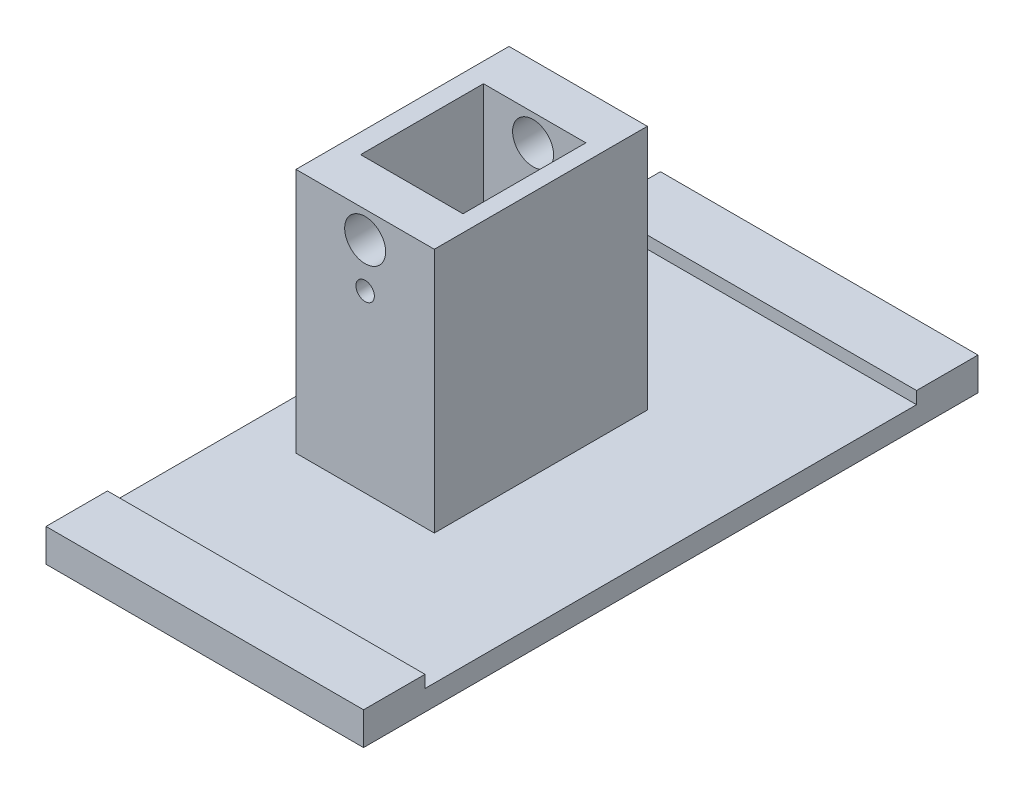
ISO-10303-21;
HEADER;
FILE_DESCRIPTION(('STEP AP214'),'2;1');
FILE_NAME('part.step','',(''),(''),'','','');
FILE_SCHEMA(('AUTOMOTIVE_DESIGN { 1 0 10303 214 1 1 1 1 }'));
ENDSEC;
DATA;
#1=APPLICATION_CONTEXT('core data for automotive mechanical design processes');
#2=APPLICATION_PROTOCOL_DEFINITION('international standard','automotive_design',2000,#1);
#3=PRODUCT_CONTEXT('',#1,'mechanical');
#4=PRODUCT('Part','Part','',(#3));
#5=PRODUCT_RELATED_PRODUCT_CATEGORY('part','',(#4));
#6=PRODUCT_DEFINITION_FORMATION('','',#4);
#7=PRODUCT_DEFINITION_CONTEXT('part definition',#1,'design');
#8=PRODUCT_DEFINITION('design','',#6,#7);
#9=PRODUCT_DEFINITION_SHAPE('','',#8);
#10=(LENGTH_UNIT() NAMED_UNIT(*) SI_UNIT(.MILLI.,.METRE.));
#11=(NAMED_UNIT(*) PLANE_ANGLE_UNIT() SI_UNIT($,.RADIAN.));
#12=(NAMED_UNIT(*) SI_UNIT($,.STERADIAN.) SOLID_ANGLE_UNIT());
#13=UNCERTAINTY_MEASURE_WITH_UNIT(LENGTH_MEASURE(1.E-05),#10,'distance_accuracy_value','');
#14=(GEOMETRIC_REPRESENTATION_CONTEXT(3) GLOBAL_UNCERTAINTY_ASSIGNED_CONTEXT((#13)) GLOBAL_UNIT_ASSIGNED_CONTEXT((#10,
#11,#12)) REPRESENTATION_CONTEXT('',''));
#15=CARTESIAN_POINT('',(0.,0.,0.));
#16=DIRECTION('',(0.,0.,1.));
#17=DIRECTION('',(1.,0.,0.));
#18=AXIS2_PLACEMENT_3D('',#15,#16,#17);
#19=CARTESIAN_POINT('',(0.,33.02,-30.48));
#20=DIRECTION('',(0.,0.,-1.));
#21=DIRECTION('',(-1.,0.,0.));
#22=AXIS2_PLACEMENT_3D('',#19,#20,#21);
#23=PLANE('',#22);
#24=CARTESIAN_POINT('',(14.68663570336,24.257,-30.48));
#25=DIRECTION('',(0.,0.,-1.));
#26=DIRECTION('',(-1.,0.,0.));
#27=AXIS2_PLACEMENT_3D('',#24,#25,#26);
#28=CIRCLE('',#27,1.143);
#29=CARTESIAN_POINT('',(13.54363570336,24.257,-30.48));
#30=VERTEX_POINT('',#29);
#31=EDGE_CURVE('E364',#30,#30,#28,.T.);
#32=ORIENTED_EDGE('',*,*,#31,.F.);
#33=EDGE_LOOP('',(#32));
#34=FACE_BOUND('',#33,.T.);
#35=CARTESIAN_POINT('',(14.68663570336,29.718,-30.48));
#36=DIRECTION('',(0.,0.,-1.));
#37=DIRECTION('',(-1.,0.,0.));
#38=AXIS2_PLACEMENT_3D('',#35,#36,#37);
#39=CIRCLE('',#38,2.54);
#40=CARTESIAN_POINT('',(12.14663570336,29.718,-30.48));
#41=VERTEX_POINT('',#40);
#42=EDGE_CURVE('E349',#41,#41,#39,.T.);
#43=ORIENTED_EDGE('',*,*,#42,.F.);
#44=EDGE_LOOP('',(#43));
#45=FACE_BOUND('',#44,.T.);
#46=DIRECTION('',(0.,-1.,0.));
#47=VECTOR('',#46,1.);
#48=CARTESIAN_POINT('',(21.2334144559747,33.02,-30.48));
#49=LINE('',#48,#47);
#50=CARTESIAN_POINT('',(21.2334144559747,33.02,-30.48));
#51=VERTEX_POINT('',#50);
#52=CARTESIAN_POINT('',(21.2334144559747,20.32,-30.48));
#53=VERTEX_POINT('',#52);
#54=EDGE_CURVE('E252',#51,#53,#49,.T.);
#55=ORIENTED_EDGE('',*,*,#54,.T.);
#56=DIRECTION('',(-1.,0.,0.));
#57=VECTOR('',#56,1.);
#58=CARTESIAN_POINT('',(8.53341445597468,20.32,-30.48));
#59=LINE('',#58,#57);
#60=CARTESIAN_POINT('',(8.53341445597468,20.32,-30.48));
#61=VERTEX_POINT('',#60);
#62=EDGE_CURVE('E213',#53,#61,#59,.T.);
#63=ORIENTED_EDGE('',*,*,#62,.T.);
#64=DIRECTION('',(0.,-1.,0.));
#65=VECTOR('',#64,1.);
#66=CARTESIAN_POINT('',(8.53341445597468,33.02,-30.48));
#67=LINE('',#66,#65);
#68=CARTESIAN_POINT('',(8.53341445597468,33.02,-30.48));
#69=VERTEX_POINT('',#68);
#70=EDGE_CURVE('E201',#69,#61,#67,.T.);
#71=ORIENTED_EDGE('',*,*,#70,.F.);
#72=DIRECTION('',(1.,0.,0.));
#73=VECTOR('',#72,1.);
#74=CARTESIAN_POINT('',(0.,33.02,-30.48));
#75=LINE('',#74,#73);
#76=EDGE_CURVE('E232',#69,#51,#75,.T.);
#77=ORIENTED_EDGE('',*,*,#76,.T.);
#78=EDGE_LOOP('',(#55,#63,#71,#77));
#79=FACE_BOUND('',#78,.T.);
#80=ADVANCED_FACE('F35',(#34,#45,#79),#23,.T.);
#81=CARTESIAN_POINT('',(0.,33.02,-45.72));
#82=DIRECTION('',(0.,0.,-1.));
#83=DIRECTION('',(-1.,0.,0.));
#84=AXIS2_PLACEMENT_3D('',#81,#82,#83);
#85=PLANE('',#84);
#86=CARTESIAN_POINT('',(14.68663570336,24.257,-45.72));
#87=DIRECTION('',(0.,0.,-1.));
#88=DIRECTION('',(-1.,0.,0.));
#89=AXIS2_PLACEMENT_3D('',#86,#87,#88);
#90=CIRCLE('',#89,1.143);
#91=CARTESIAN_POINT('',(13.54363570336,24.257,-45.72));
#92=VERTEX_POINT('',#91);
#93=EDGE_CURVE('E367',#92,#92,#90,.T.);
#94=ORIENTED_EDGE('',*,*,#93,.T.);
#95=EDGE_LOOP('',(#94));
#96=FACE_BOUND('',#95,.T.);
#97=CARTESIAN_POINT('',(14.68663570336,29.718,-45.72));
#98=DIRECTION('',(0.,0.,-1.));
#99=DIRECTION('',(-1.,0.,0.));
#100=AXIS2_PLACEMENT_3D('',#97,#98,#99);
#101=CIRCLE('',#100,2.54);
#102=CARTESIAN_POINT('',(12.14663570336,29.718,-45.72));
#103=VERTEX_POINT('',#102);
#104=EDGE_CURVE('E351',#103,#103,#101,.T.);
#105=ORIENTED_EDGE('',*,*,#104,.T.);
#106=EDGE_LOOP('',(#105));
#107=FACE_BOUND('',#106,.T.);
#108=DIRECTION('',(1.,0.,0.));
#109=VECTOR('',#108,1.);
#110=CARTESIAN_POINT('',(21.2334144559747,20.32,-45.72));
#111=LINE('',#110,#109);
#112=CARTESIAN_POINT('',(8.53341445597468,20.32,-45.72));
#113=VERTEX_POINT('',#112);
#114=CARTESIAN_POINT('',(21.2334144559747,20.32,-45.72));
#115=VERTEX_POINT('',#114);
#116=EDGE_CURVE('E223',#113,#115,#111,.T.);
#117=ORIENTED_EDGE('',*,*,#116,.T.);
#118=DIRECTION('',(0.,-1.,0.));
#119=VECTOR('',#118,1.);
#120=CARTESIAN_POINT('',(21.2334144559747,33.02,-45.72));
#121=LINE('',#120,#119);
#122=CARTESIAN_POINT('',(21.2334144559747,33.02,-45.72));
#123=VERTEX_POINT('',#122);
#124=EDGE_CURVE('E266',#123,#115,#121,.T.);
#125=ORIENTED_EDGE('',*,*,#124,.F.);
#126=DIRECTION('',(1.,0.,0.));
#127=VECTOR('',#126,1.);
#128=CARTESIAN_POINT('',(0.,33.02,-45.72));
#129=LINE('',#128,#127);
#130=CARTESIAN_POINT('',(8.53341445597468,33.02,-45.72));
#131=VERTEX_POINT('',#130);
#132=EDGE_CURVE('E237',#131,#123,#129,.T.);
#133=ORIENTED_EDGE('',*,*,#132,.F.);
#134=DIRECTION('',(0.,-1.,0.));
#135=VECTOR('',#134,1.);
#136=CARTESIAN_POINT('',(8.53341445597468,33.02,-45.72));
#137=LINE('',#136,#135);
#138=EDGE_CURVE('E269',#131,#113,#137,.T.);
#139=ORIENTED_EDGE('',*,*,#138,.T.);
#140=EDGE_LOOP('',(#117,#125,#133,#139));
#141=FACE_BOUND('',#140,.T.);
#142=ADVANCED_FACE('F338',(#96,#107,#141),#85,.F.);
#143=CARTESIAN_POINT('',(39.3827,4.064,0.));
#144=DIRECTION('',(-1.,0.,0.));
#145=DIRECTION('',(0.,0.,1.));
#146=AXIS2_PLACEMENT_3D('',#143,#144,#145);
#147=PLANE('',#146);
#148=DIRECTION('',(0.,0.,-1.));
#149=VECTOR('',#148,1.);
#150=CARTESIAN_POINT('',(39.3827,0.,0.));
#151=LINE('',#150,#149);
#152=CARTESIAN_POINT('',(39.3827,0.,0.));
#153=VERTEX_POINT('',#152);
#154=CARTESIAN_POINT('',(39.3827,0.,-76.2));
#155=VERTEX_POINT('',#154);
#156=EDGE_CURVE('E495',#153,#155,#151,.T.);
#157=ORIENTED_EDGE('',*,*,#156,.T.);
#158=DIRECTION('',(0.,-1.,0.));
#159=VECTOR('',#158,1.);
#160=CARTESIAN_POINT('',(39.3827,4.064,-76.2));
#161=LINE('',#160,#159);
#162=CARTESIAN_POINT('',(39.3827,4.064,-76.2));
#163=VERTEX_POINT('',#162);
#164=EDGE_CURVE('E517',#163,#155,#161,.T.);
#165=ORIENTED_EDGE('',*,*,#164,.F.);
#166=DIRECTION('',(0.,0.,-1.));
#167=VECTOR('',#166,1.);
#168=CARTESIAN_POINT('',(39.3827,4.064,0.));
#169=LINE('',#168,#167);
#170=CARTESIAN_POINT('',(39.3827,4.064,-68.58));
#171=VERTEX_POINT('',#170);
#172=EDGE_CURVE('E276',#171,#163,#169,.T.);
#173=ORIENTED_EDGE('',*,*,#172,.F.);
#174=DIRECTION('',(0.,-1.,0.));
#175=VECTOR('',#174,1.);
#176=CARTESIAN_POINT('',(39.3827,4.064,-68.58));
#177=LINE('',#176,#175);
#178=CARTESIAN_POINT('',(39.3827,2.54,-68.58));
#179=VERTEX_POINT('',#178);
#180=EDGE_CURVE('E294',#171,#179,#177,.T.);
#181=ORIENTED_EDGE('',*,*,#180,.T.);
#182=DIRECTION('',(0.,0.,-1.));
#183=VECTOR('',#182,1.);
#184=CARTESIAN_POINT('',(39.3827,2.54,0.));
#185=LINE('',#184,#183);
#186=CARTESIAN_POINT('',(39.3827,2.54,-7.62));
#187=VERTEX_POINT('',#186);
#188=EDGE_CURVE('E536',#187,#179,#185,.T.);
#189=ORIENTED_EDGE('',*,*,#188,.F.);
#190=DIRECTION('',(0.,-1.,0.));
#191=VECTOR('',#190,1.);
#192=CARTESIAN_POINT('',(39.3827,4.064,-7.62));
#193=LINE('',#192,#191);
#194=CARTESIAN_POINT('',(39.3827,4.064,-7.62));
#195=VERTEX_POINT('',#194);
#196=EDGE_CURVE('E317',#195,#187,#193,.T.);
#197=ORIENTED_EDGE('',*,*,#196,.F.);
#198=DIRECTION('',(0.,0.,-1.));
#199=VECTOR('',#198,1.);
#200=CARTESIAN_POINT('',(39.3827,4.064,0.));
#201=LINE('',#200,#199);
#202=CARTESIAN_POINT('',(39.3827,4.064,0.));
#203=VERTEX_POINT('',#202);
#204=EDGE_CURVE('E492',#203,#195,#201,.T.);
#205=ORIENTED_EDGE('',*,*,#204,.F.);
#206=DIRECTION('',(0.,-1.,0.));
#207=VECTOR('',#206,1.);
#208=CARTESIAN_POINT('',(39.3827,4.064,0.));
#209=LINE('',#208,#207);
#210=EDGE_CURVE('E486',#203,#153,#209,.T.);
#211=ORIENTED_EDGE('',*,*,#210,.T.);
#212=EDGE_LOOP('',(#157,#165,#173,#181,#189,#197,#205,#211));
#213=FACE_BOUND('',#212,.T.);
#214=ADVANCED_FACE('F37',(#213),#147,.F.);
#215=CARTESIAN_POINT('',(0.,4.064,-7.62));
#216=DIRECTION('',(0.,0.,1.));
#217=DIRECTION('',(1.,0.,0.));
#218=AXIS2_PLACEMENT_3D('',#215,#216,#217);
#219=PLANE('',#218);
#220=ORIENTED_EDGE('',*,*,#196,.T.);
#221=DIRECTION('',(-1.,0.,0.));
#222=VECTOR('',#221,1.);
#223=CARTESIAN_POINT('',(0.,2.54,-7.62));
#224=LINE('',#223,#222);
#225=CARTESIAN_POINT('',(0.,2.54,-7.62));
#226=VERTEX_POINT('',#225);
#227=EDGE_CURVE('E471',#187,#226,#224,.T.);
#228=ORIENTED_EDGE('',*,*,#227,.T.);
#229=DIRECTION('',(0.,-1.,0.));
#230=VECTOR('',#229,1.);
#231=CARTESIAN_POINT('',(0.,4.064,-7.62));
#232=LINE('',#231,#230);
#233=CARTESIAN_POINT('',(0.,4.064,-7.62));
#234=VERTEX_POINT('',#233);
#235=EDGE_CURVE('E476',#234,#226,#232,.T.);
#236=ORIENTED_EDGE('',*,*,#235,.F.);
#237=DIRECTION('',(-1.,0.,0.));
#238=VECTOR('',#237,1.);
#239=CARTESIAN_POINT('',(0.,4.064,-7.62));
#240=LINE('',#239,#238);
#241=EDGE_CURVE('E473',#195,#234,#240,.T.);
#242=ORIENTED_EDGE('',*,*,#241,.F.);
#243=EDGE_LOOP('',(#220,#228,#236,#242));
#244=FACE_BOUND('',#243,.T.);
#245=ADVANCED_FACE('F460',(#244),#219,.F.);
#246=CARTESIAN_POINT('',(0.,4.064,0.));
#247=DIRECTION('',(-1.,0.,0.));
#248=DIRECTION('',(0.,0.,1.));
#249=AXIS2_PLACEMENT_3D('',#246,#247,#248);
#250=PLANE('',#249);
#251=DIRECTION('',(0.,0.,-1.));
#252=VECTOR('',#251,1.);
#253=CARTESIAN_POINT('',(0.,0.,0.));
#254=LINE('',#253,#252);
#255=CARTESIAN_POINT('',(0.,0.,0.));
#256=VERTEX_POINT('',#255);
#257=CARTESIAN_POINT('',(0.,0.,-34.29));
#258=VERTEX_POINT('',#257);
#259=EDGE_CURVE('E493',#256,#258,#254,.T.);
#260=ORIENTED_EDGE('',*,*,#259,.F.);
#261=DIRECTION('',(0.,-1.,0.));
#262=VECTOR('',#261,1.);
#263=CARTESIAN_POINT('',(0.,4.064,0.));
#264=LINE('',#263,#262);
#265=CARTESIAN_POINT('',(0.,4.064,0.));
#266=VERTEX_POINT('',#265);
#267=EDGE_CURVE('E478',#266,#256,#264,.T.);
#268=ORIENTED_EDGE('',*,*,#267,.F.);
#269=DIRECTION('',(0.,0.,-1.));
#270=VECTOR('',#269,1.);
#271=CARTESIAN_POINT('',(0.,4.064,0.));
#272=LINE('',#271,#270);
#273=EDGE_CURVE('E499',#266,#234,#272,.T.);
#274=ORIENTED_EDGE('',*,*,#273,.T.);
#275=ORIENTED_EDGE('',*,*,#235,.T.);
#276=DIRECTION('',(0.,0.,-1.));
#277=VECTOR('',#276,1.);
#278=CARTESIAN_POINT('',(0.,2.54,0.));
#279=LINE('',#278,#277);
#280=CARTESIAN_POINT('',(0.,2.54,-34.29));
#281=VERTEX_POINT('',#280);
#282=EDGE_CURVE('E58',#226,#281,#279,.T.);
#283=ORIENTED_EDGE('',*,*,#282,.T.);
#284=DIRECTION('',(0.,-1.,0.));
#285=VECTOR('',#284,1.);
#286=CARTESIAN_POINT('',(0.,2.54,-34.29));
#287=LINE('',#286,#285);
#288=EDGE_CURVE('E505',#281,#258,#287,.T.);
#289=ORIENTED_EDGE('',*,*,#288,.T.);
#290=EDGE_LOOP('',(#260,#268,#274,#275,#283,#289));
#291=FACE_BOUND('',#290,.T.);
#292=ADVANCED_FACE('F457',(#291),#250,.T.);
#293=CARTESIAN_POINT('',(0.,4.064,0.));
#294=DIRECTION('',(0.,0.,-1.));
#295=DIRECTION('',(-1.,0.,0.));
#296=AXIS2_PLACEMENT_3D('',#293,#294,#295);
#297=PLANE('',#296);
#298=DIRECTION('',(1.,0.,0.));
#299=VECTOR('',#298,1.);
#300=CARTESIAN_POINT('',(0.,0.,0.));
#301=LINE('',#300,#299);
#302=EDGE_CURVE('E490',#256,#153,#301,.T.);
#303=ORIENTED_EDGE('',*,*,#302,.T.);
#304=ORIENTED_EDGE('',*,*,#210,.F.);
#305=DIRECTION('',(1.,0.,0.));
#306=VECTOR('',#305,1.);
#307=CARTESIAN_POINT('',(0.,4.064,0.));
#308=LINE('',#307,#306);
#309=EDGE_CURVE('E489',#266,#203,#308,.T.);
#310=ORIENTED_EDGE('',*,*,#309,.F.);
#311=ORIENTED_EDGE('',*,*,#267,.T.);
#312=EDGE_LOOP('',(#303,#304,#310,#311));
#313=FACE_BOUND('',#312,.T.);
#314=ADVANCED_FACE('F450',(#313),#297,.F.);
#315=CARTESIAN_POINT('',(0.,4.064,0.));
#316=DIRECTION('',(0.,1.,0.));
#317=DIRECTION('',(0.,0.,1.));
#318=AXIS2_PLACEMENT_3D('',#315,#316,#317);
#319=PLANE('',#318);
#320=ORIENTED_EDGE('',*,*,#204,.T.);
#321=ORIENTED_EDGE('',*,*,#241,.T.);
#322=ORIENTED_EDGE('',*,*,#273,.F.);
#323=ORIENTED_EDGE('',*,*,#309,.T.);
#324=EDGE_LOOP('',(#320,#321,#322,#323));
#325=FACE_BOUND('',#324,.T.);
#326=ADVANCED_FACE('F447',(#325),#319,.T.);
#327=CARTESIAN_POINT('',(0.,0.,0.));
#328=DIRECTION('',(0.,1.,0.));
#329=DIRECTION('',(0.,0.,1.));
#330=AXIS2_PLACEMENT_3D('',#327,#328,#329);
#331=PLANE('',#330);
#332=ORIENTED_EDGE('',*,*,#156,.F.);
#333=ORIENTED_EDGE('',*,*,#302,.F.);
#334=ORIENTED_EDGE('',*,*,#259,.T.);
#335=CARTESIAN_POINT('',(0.,0.,-38.1));
#336=DIRECTION('',(0.,1.,0.));
#337=DIRECTION('',(0.,0.,1.));
#338=AXIS2_PLACEMENT_3D('',#335,#336,#337);
#339=CIRCLE('',#338,3.81);
#340=CARTESIAN_POINT('',(0.,0.,-41.91));
#341=VERTEX_POINT('',#340);
#342=EDGE_CURVE('E309',#341,#258,#339,.F.);
#343=ORIENTED_EDGE('',*,*,#342,.F.);
#344=DIRECTION('',(0.,0.,-1.));
#345=VECTOR('',#344,1.);
#346=CARTESIAN_POINT('',(0.,0.,0.));
#347=LINE('',#346,#345);
#348=CARTESIAN_POINT('',(0.,0.,-76.2));
#349=VERTEX_POINT('',#348);
#350=EDGE_CURVE('E510',#341,#349,#347,.T.);
#351=ORIENTED_EDGE('',*,*,#350,.T.);
#352=DIRECTION('',(1.,0.,0.));
#353=VECTOR('',#352,1.);
#354=CARTESIAN_POINT('',(0.,0.,-76.2));
#355=LINE('',#354,#353);
#356=EDGE_CURVE('E263',#349,#155,#355,.T.);
#357=ORIENTED_EDGE('',*,*,#356,.T.);
#358=EDGE_LOOP('',(#332,#333,#334,#343,#351,#357));
#359=FACE_BOUND('',#358,.T.);
#360=ADVANCED_FACE('F442',(#359),#331,.F.);
#361=CARTESIAN_POINT('',(0.,2.54,0.));
#362=DIRECTION('',(-1.,0.,0.));
#363=DIRECTION('',(0.,0.,1.));
#364=AXIS2_PLACEMENT_3D('',#361,#362,#363);
#365=PLANE('',#364);
#366=ORIENTED_EDGE('',*,*,#350,.F.);
#367=DIRECTION('',(0.,-1.,0.));
#368=VECTOR('',#367,1.);
#369=CARTESIAN_POINT('',(0.,2.54,-41.91));
#370=LINE('',#369,#368);
#371=CARTESIAN_POINT('',(0.,2.54,-41.91));
#372=VERTEX_POINT('',#371);
#373=EDGE_CURVE('E497',#372,#341,#370,.T.);
#374=ORIENTED_EDGE('',*,*,#373,.F.);
#375=CARTESIAN_POINT('',(0.,2.54,-68.58));
#376=VERTEX_POINT('',#375);
#377=EDGE_CURVE('E305',#372,#376,#279,.T.);
#378=ORIENTED_EDGE('',*,*,#377,.T.);
#379=DIRECTION('',(0.,-1.,0.));
#380=VECTOR('',#379,1.);
#381=CARTESIAN_POINT('',(0.,4.064,-68.58));
#382=LINE('',#381,#380);
#383=CARTESIAN_POINT('',(0.,4.064,-68.58));
#384=VERTEX_POINT('',#383);
#385=EDGE_CURVE('E284',#384,#376,#382,.T.);
#386=ORIENTED_EDGE('',*,*,#385,.F.);
#387=DIRECTION('',(0.,0.,-1.));
#388=VECTOR('',#387,1.);
#389=CARTESIAN_POINT('',(0.,4.064,0.));
#390=LINE('',#389,#388);
#391=CARTESIAN_POINT('',(0.,4.064,-76.2));
#392=VERTEX_POINT('',#391);
#393=EDGE_CURVE('E281',#384,#392,#390,.T.);
#394=ORIENTED_EDGE('',*,*,#393,.T.);
#395=DIRECTION('',(0.,-1.,0.));
#396=VECTOR('',#395,1.);
#397=CARTESIAN_POINT('',(0.,4.064,-76.2));
#398=LINE('',#397,#396);
#399=EDGE_CURVE('E289',#392,#349,#398,.T.);
#400=ORIENTED_EDGE('',*,*,#399,.T.);
#401=EDGE_LOOP('',(#366,#374,#378,#386,#394,#400));
#402=FACE_BOUND('',#401,.T.);
#403=ADVANCED_FACE('F439',(#402),#365,.T.);
#404=CARTESIAN_POINT('',(0.,2.54,-38.1));
#405=DIRECTION('',(0.,-1.,0.));
#406=DIRECTION('',(0.,0.,-1.));
#407=AXIS2_PLACEMENT_3D('',#404,#405,#406);
#408=CYLINDRICAL_SURFACE('',#407,3.81);
#409=ORIENTED_EDGE('',*,*,#342,.T.);
#410=ORIENTED_EDGE('',*,*,#288,.F.);
#411=CARTESIAN_POINT('',(0.,2.54,-38.1));
#412=DIRECTION('',(0.,1.,0.));
#413=DIRECTION('',(0.,0.,1.));
#414=AXIS2_PLACEMENT_3D('',#411,#412,#413);
#415=CIRCLE('',#414,3.81);
#416=EDGE_CURVE('E298',#372,#281,#415,.F.);
#417=ORIENTED_EDGE('',*,*,#416,.F.);
#418=ORIENTED_EDGE('',*,*,#373,.T.);
#419=EDGE_LOOP('',(#409,#410,#417,#418));
#420=FACE_BOUND('',#419,.T.);
#421=ADVANCED_FACE('F438',(#420),#408,.F.);
#422=CARTESIAN_POINT('',(0.,2.54,0.));
#423=DIRECTION('',(0.,1.,0.));
#424=DIRECTION('',(0.,0.,1.));
#425=AXIS2_PLACEMENT_3D('',#422,#423,#424);
#426=PLANE('',#425);
#427=DIRECTION('',(0.,0.,-1.));
#428=VECTOR('',#427,1.);
#429=CARTESIAN_POINT('',(23.2654144559747,2.54,0.));
#430=LINE('',#429,#428);
#431=CARTESIAN_POINT('',(23.2654144559747,2.54,-24.892));
#432=VERTEX_POINT('',#431);
#433=CARTESIAN_POINT('',(23.2654144559747,2.54,-51.308));
#434=VERTEX_POINT('',#433);
#435=EDGE_CURVE('E321',#432,#434,#430,.T.);
#436=ORIENTED_EDGE('',*,*,#435,.F.);
#437=DIRECTION('',(-1.,0.,0.));
#438=VECTOR('',#437,1.);
#439=CARTESIAN_POINT('',(0.,2.54,-24.892));
#440=LINE('',#439,#438);
#441=CARTESIAN_POINT('',(6.10785695074527,2.54,-24.892));
#442=VERTEX_POINT('',#441);
#443=EDGE_CURVE('E313',#432,#442,#440,.T.);
#444=ORIENTED_EDGE('',*,*,#443,.T.);
#445=DIRECTION('',(0.,0.,1.));
#446=VECTOR('',#445,1.);
#447=CARTESIAN_POINT('',(6.10785695074527,2.54,0.));
#448=LINE('',#447,#446);
#449=CARTESIAN_POINT('',(6.10785695074527,2.54,-51.308));
#450=VERTEX_POINT('',#449);
#451=EDGE_CURVE('E316',#450,#442,#448,.T.);
#452=ORIENTED_EDGE('',*,*,#451,.F.);
#453=DIRECTION('',(-1.,0.,0.));
#454=VECTOR('',#453,1.);
#455=CARTESIAN_POINT('',(0.,2.54,-51.308));
#456=LINE('',#455,#454);
#457=EDGE_CURVE('E319',#434,#450,#456,.T.);
#458=ORIENTED_EDGE('',*,*,#457,.F.);
#459=EDGE_LOOP('',(#436,#444,#452,#458));
#460=FACE_BOUND('',#459,.T.);
#461=ORIENTED_EDGE('',*,*,#377,.F.);
#462=ORIENTED_EDGE('',*,*,#416,.T.);
#463=ORIENTED_EDGE('',*,*,#282,.F.);
#464=ORIENTED_EDGE('',*,*,#227,.F.);
#465=ORIENTED_EDGE('',*,*,#188,.T.);
#466=DIRECTION('',(-1.,0.,0.));
#467=VECTOR('',#466,1.);
#468=CARTESIAN_POINT('',(0.,2.54,-68.58));
#469=LINE('',#468,#467);
#470=EDGE_CURVE('E310',#179,#376,#469,.T.);
#471=ORIENTED_EDGE('',*,*,#470,.T.);
#472=EDGE_LOOP('',(#461,#462,#463,#464,#465,#471));
#473=FACE_BOUND('',#472,.T.);
#474=ADVANCED_FACE('F395',(#460,#473),#426,.T.);
#475=CARTESIAN_POINT('',(0.,4.064,-68.58));
#476=DIRECTION('',(0.,0.,1.));
#477=DIRECTION('',(1.,0.,0.));
#478=AXIS2_PLACEMENT_3D('',#475,#476,#477);
#479=PLANE('',#478);
#480=ORIENTED_EDGE('',*,*,#470,.F.);
#481=ORIENTED_EDGE('',*,*,#180,.F.);
#482=DIRECTION('',(-1.,0.,0.));
#483=VECTOR('',#482,1.);
#484=CARTESIAN_POINT('',(0.,4.064,-68.58));
#485=LINE('',#484,#483);
#486=EDGE_CURVE('E273',#171,#384,#485,.T.);
#487=ORIENTED_EDGE('',*,*,#486,.T.);
#488=ORIENTED_EDGE('',*,*,#385,.T.);
#489=EDGE_LOOP('',(#480,#481,#487,#488));
#490=FACE_BOUND('',#489,.T.);
#491=ADVANCED_FACE('F431',(#490),#479,.T.);
#492=CARTESIAN_POINT('',(0.,4.064,-76.2));
#493=DIRECTION('',(0.,0.,-1.));
#494=DIRECTION('',(-1.,0.,0.));
#495=AXIS2_PLACEMENT_3D('',#492,#493,#494);
#496=PLANE('',#495);
#497=ORIENTED_EDGE('',*,*,#356,.F.);
#498=ORIENTED_EDGE('',*,*,#399,.F.);
#499=DIRECTION('',(1.,0.,0.));
#500=VECTOR('',#499,1.);
#501=CARTESIAN_POINT('',(0.,4.064,-76.2));
#502=LINE('',#501,#500);
#503=EDGE_CURVE('E278',#392,#163,#502,.T.);
#504=ORIENTED_EDGE('',*,*,#503,.T.);
#505=ORIENTED_EDGE('',*,*,#164,.T.);
#506=EDGE_LOOP('',(#497,#498,#504,#505));
#507=FACE_BOUND('',#506,.T.);
#508=ADVANCED_FACE('F427',(#507),#496,.T.);
#509=CARTESIAN_POINT('',(0.,4.064,0.));
#510=DIRECTION('',(0.,1.,0.));
#511=DIRECTION('',(0.,0.,1.));
#512=AXIS2_PLACEMENT_3D('',#509,#510,#511);
#513=PLANE('',#512);
#514=ORIENTED_EDGE('',*,*,#486,.F.);
#515=ORIENTED_EDGE('',*,*,#172,.T.);
#516=ORIENTED_EDGE('',*,*,#503,.F.);
#517=ORIENTED_EDGE('',*,*,#393,.F.);
#518=EDGE_LOOP('',(#514,#515,#516,#517));
#519=FACE_BOUND('',#518,.T.);
#520=ADVANCED_FACE('F424',(#519),#513,.T.);
#521=CARTESIAN_POINT('',(23.2654144559747,33.02,0.));
#522=DIRECTION('',(1.,0.,0.));
#523=DIRECTION('',(0.,0.,-1.));
#524=AXIS2_PLACEMENT_3D('',#521,#522,#523);
#525=PLANE('',#524);
#526=DIRECTION('',(0.,-1.,0.));
#527=VECTOR('',#526,1.);
#528=CARTESIAN_POINT('',(23.2654144559747,33.02,-24.892));
#529=LINE('',#528,#527);
#530=CARTESIAN_POINT('',(23.2654144559747,33.02,-24.892));
#531=VERTEX_POINT('',#530);
#532=EDGE_CURVE('E253',#531,#432,#529,.T.);
#533=ORIENTED_EDGE('',*,*,#532,.T.);
#534=ORIENTED_EDGE('',*,*,#435,.T.);
#535=DIRECTION('',(0.,-1.,0.));
#536=VECTOR('',#535,1.);
#537=CARTESIAN_POINT('',(23.2654144559747,33.02,-51.308));
#538=LINE('',#537,#536);
#539=CARTESIAN_POINT('',(23.2654144559747,33.02,-51.308));
#540=VERTEX_POINT('',#539);
#541=EDGE_CURVE('E260',#540,#434,#538,.T.);
#542=ORIENTED_EDGE('',*,*,#541,.F.);
#543=DIRECTION('',(0.,0.,1.));
#544=VECTOR('',#543,1.);
#545=CARTESIAN_POINT('',(23.2654144559747,33.02,0.));
#546=LINE('',#545,#544);
#547=EDGE_CURVE('E241',#540,#531,#546,.T.);
#548=ORIENTED_EDGE('',*,*,#547,.T.);
#549=EDGE_LOOP('',(#533,#534,#542,#548));
#550=FACE_BOUND('',#549,.T.);
#551=ADVANCED_FACE('F384',(#550),#525,.T.);
#552=CARTESIAN_POINT('',(0.,33.02,-51.308));
#553=DIRECTION('',(0.,0.,-1.));
#554=DIRECTION('',(-1.,0.,0.));
#555=AXIS2_PLACEMENT_3D('',#552,#553,#554);
#556=PLANE('',#555);
#557=CARTESIAN_POINT('',(14.68663570336,24.257,-51.308));
#558=DIRECTION('',(0.,0.,-1.));
#559=DIRECTION('',(-1.,0.,0.));
#560=AXIS2_PLACEMENT_3D('',#557,#558,#559);
#561=CIRCLE('',#560,1.143);
#562=CARTESIAN_POINT('',(13.54363570336,24.257,-51.308));
#563=VERTEX_POINT('',#562);
#564=EDGE_CURVE('E373',#563,#563,#561,.T.);
#565=ORIENTED_EDGE('',*,*,#564,.F.);
#566=EDGE_LOOP('',(#565));
#567=FACE_BOUND('',#566,.T.);
#568=CARTESIAN_POINT('',(14.68663570336,29.718,-51.308));
#569=DIRECTION('',(0.,0.,-1.));
#570=DIRECTION('',(-1.,0.,0.));
#571=AXIS2_PLACEMENT_3D('',#568,#569,#570);
#572=CIRCLE('',#571,2.54);
#573=CARTESIAN_POINT('',(12.14663570336,29.718,-51.308));
#574=VERTEX_POINT('',#573);
#575=EDGE_CURVE('E361',#574,#574,#572,.T.);
#576=ORIENTED_EDGE('',*,*,#575,.F.);
#577=EDGE_LOOP('',(#576));
#578=FACE_BOUND('',#577,.T.);
#579=ORIENTED_EDGE('',*,*,#541,.T.);
#580=ORIENTED_EDGE('',*,*,#457,.T.);
#581=DIRECTION('',(0.,-1.,0.));
#582=VECTOR('',#581,1.);
#583=CARTESIAN_POINT('',(6.10785695074527,33.02,-51.308));
#584=LINE('',#583,#582);
#585=CARTESIAN_POINT('',(6.10785695074527,33.02,-51.308));
#586=VERTEX_POINT('',#585);
#587=EDGE_CURVE('E257',#586,#450,#584,.T.);
#588=ORIENTED_EDGE('',*,*,#587,.F.);
#589=DIRECTION('',(1.,0.,0.));
#590=VECTOR('',#589,1.);
#591=CARTESIAN_POINT('',(0.,33.02,-51.308));
#592=LINE('',#591,#590);
#593=EDGE_CURVE('E244',#586,#540,#592,.T.);
#594=ORIENTED_EDGE('',*,*,#593,.T.);
#595=EDGE_LOOP('',(#579,#580,#588,#594));
#596=FACE_BOUND('',#595,.T.);
#597=ADVANCED_FACE('F380',(#567,#578,#596),#556,.T.);
#598=CARTESIAN_POINT('',(6.10785695074527,33.02,0.));
#599=DIRECTION('',(-1.,0.,0.));
#600=DIRECTION('',(0.,0.,1.));
#601=AXIS2_PLACEMENT_3D('',#598,#599,#600);
#602=PLANE('',#601);
#603=ORIENTED_EDGE('',*,*,#587,.T.);
#604=ORIENTED_EDGE('',*,*,#451,.T.);
#605=DIRECTION('',(0.,-1.,0.));
#606=VECTOR('',#605,1.);
#607=CARTESIAN_POINT('',(6.10785695074527,33.02,-24.892));
#608=LINE('',#607,#606);
#609=CARTESIAN_POINT('',(6.10785695074527,33.02,-24.892));
#610=VERTEX_POINT('',#609);
#611=EDGE_CURVE('E50',#610,#442,#608,.T.);
#612=ORIENTED_EDGE('',*,*,#611,.F.);
#613=DIRECTION('',(0.,0.,-1.));
#614=VECTOR('',#613,1.);
#615=CARTESIAN_POINT('',(6.10785695074527,33.02,0.));
#616=LINE('',#615,#614);
#617=EDGE_CURVE('E247',#610,#586,#616,.T.);
#618=ORIENTED_EDGE('',*,*,#617,.T.);
#619=EDGE_LOOP('',(#603,#604,#612,#618));
#620=FACE_BOUND('',#619,.T.);
#621=ADVANCED_FACE('F383',(#620),#602,.T.);
#622=CARTESIAN_POINT('',(8.53341445597469,33.02,0.));
#623=DIRECTION('',(1.,0.,0.));
#624=DIRECTION('',(0.,0.,-1.));
#625=AXIS2_PLACEMENT_3D('',#622,#623,#624);
#626=PLANE('',#625);
#627=ORIENTED_EDGE('',*,*,#70,.T.);
#628=DIRECTION('',(0.,0.,1.));
#629=VECTOR('',#628,1.);
#630=CARTESIAN_POINT('',(8.53341445597468,20.32,-27.94));
#631=LINE('',#630,#629);
#632=CARTESIAN_POINT('',(8.53341445597468,20.32,-27.94));
#633=VERTEX_POINT('',#632);
#634=EDGE_CURVE('E187',#61,#633,#631,.T.);
#635=ORIENTED_EDGE('',*,*,#634,.T.);
#636=DIRECTION('',(0.,-1.,0.));
#637=VECTOR('',#636,1.);
#638=CARTESIAN_POINT('',(8.53341445597468,20.32,-27.94));
#639=LINE('',#638,#637);
#640=CARTESIAN_POINT('',(8.53341445597468,2.54,-27.94));
#641=VERTEX_POINT('',#640);
#642=EDGE_CURVE('E199',#633,#641,#639,.T.);
#643=ORIENTED_EDGE('',*,*,#642,.T.);
#644=DIRECTION('',(0.,0.,-1.));
#645=VECTOR('',#644,1.);
#646=CARTESIAN_POINT('',(8.53341445597469,2.54,0.));
#647=LINE('',#646,#645);
#648=CARTESIAN_POINT('',(8.53341445597468,2.54,-48.26));
#649=VERTEX_POINT('',#648);
#650=EDGE_CURVE('E11',#641,#649,#647,.T.);
#651=ORIENTED_EDGE('',*,*,#650,.T.);
#652=DIRECTION('',(0.,-1.,0.));
#653=VECTOR('',#652,1.);
#654=CARTESIAN_POINT('',(8.53341445597468,20.32,-48.26));
#655=LINE('',#654,#653);
#656=CARTESIAN_POINT('',(8.53341445597468,20.32,-48.26));
#657=VERTEX_POINT('',#656);
#658=EDGE_CURVE('E225',#657,#649,#655,.T.);
#659=ORIENTED_EDGE('',*,*,#658,.F.);
#660=DIRECTION('',(0.,0.,1.));
#661=VECTOR('',#660,1.);
#662=CARTESIAN_POINT('',(8.53341445597468,20.32,-45.72));
#663=LINE('',#662,#661);
#664=EDGE_CURVE('E221',#657,#113,#663,.T.);
#665=ORIENTED_EDGE('',*,*,#664,.T.);
#666=ORIENTED_EDGE('',*,*,#138,.F.);
#667=DIRECTION('',(0.,0.,1.));
#668=VECTOR('',#667,1.);
#669=CARTESIAN_POINT('',(8.53341445597469,33.02,0.));
#670=LINE('',#669,#668);
#671=EDGE_CURVE('E235',#131,#69,#670,.T.);
#672=ORIENTED_EDGE('',*,*,#671,.T.);
#673=EDGE_LOOP('',(#627,#635,#643,#651,#659,#665,#666,#672));
#674=FACE_BOUND('',#673,.T.);
#675=ADVANCED_FACE('F198',(#674),#626,.T.);
#676=CARTESIAN_POINT('',(21.2334144559747,33.02,0.));
#677=DIRECTION('',(1.,0.,0.));
#678=DIRECTION('',(0.,0.,-1.));
#679=AXIS2_PLACEMENT_3D('',#676,#677,#678);
#680=PLANE('',#679);
#681=DIRECTION('',(0.,0.,-1.));
#682=VECTOR('',#681,1.);
#683=CARTESIAN_POINT('',(21.2334144559747,2.54,0.));
#684=LINE('',#683,#682);
#685=CARTESIAN_POINT('',(21.2334144559747,2.54,-27.94));
#686=VERTEX_POINT('',#685);
#687=CARTESIAN_POINT('',(21.2334144559747,2.54,-48.26));
#688=VERTEX_POINT('',#687);
#689=EDGE_CURVE('E43',#686,#688,#684,.T.);
#690=ORIENTED_EDGE('',*,*,#689,.F.);
#691=DIRECTION('',(0.,-1.,0.));
#692=VECTOR('',#691,1.);
#693=CARTESIAN_POINT('',(21.2334144559747,20.32,-27.94));
#694=LINE('',#693,#692);
#695=CARTESIAN_POINT('',(21.2334144559747,20.32,-27.94));
#696=VERTEX_POINT('',#695);
#697=EDGE_CURVE('E208',#696,#686,#694,.T.);
#698=ORIENTED_EDGE('',*,*,#697,.F.);
#699=DIRECTION('',(0.,0.,-1.));
#700=VECTOR('',#699,1.);
#701=CARTESIAN_POINT('',(21.2334144559747,20.32,-30.48));
#702=LINE('',#701,#700);
#703=EDGE_CURVE('E189',#696,#53,#702,.T.);
#704=ORIENTED_EDGE('',*,*,#703,.T.);
#705=ORIENTED_EDGE('',*,*,#54,.F.);
#706=DIRECTION('',(0.,0.,1.));
#707=VECTOR('',#706,1.);
#708=CARTESIAN_POINT('',(21.2334144559747,33.02,0.));
#709=LINE('',#708,#707);
#710=EDGE_CURVE('E239',#123,#51,#709,.T.);
#711=ORIENTED_EDGE('',*,*,#710,.F.);
#712=ORIENTED_EDGE('',*,*,#124,.T.);
#713=DIRECTION('',(0.,0.,-1.));
#714=VECTOR('',#713,1.);
#715=CARTESIAN_POINT('',(21.2334144559747,20.32,-48.26));
#716=LINE('',#715,#714);
#717=CARTESIAN_POINT('',(21.2334144559747,20.32,-48.26));
#718=VERTEX_POINT('',#717);
#719=EDGE_CURVE('E211',#115,#718,#716,.T.);
#720=ORIENTED_EDGE('',*,*,#719,.T.);
#721=DIRECTION('',(0.,-1.,0.));
#722=VECTOR('',#721,1.);
#723=CARTESIAN_POINT('',(21.2334144559747,20.32,-48.26));
#724=LINE('',#723,#722);
#725=EDGE_CURVE('E229',#718,#688,#724,.T.);
#726=ORIENTED_EDGE('',*,*,#725,.T.);
#727=EDGE_LOOP('',(#690,#698,#704,#705,#711,#712,#720,#726));
#728=FACE_BOUND('',#727,.T.);
#729=ADVANCED_FACE('F330',(#728),#680,.F.);
#730=CARTESIAN_POINT('',(0.,33.02,-24.892));
#731=DIRECTION('',(0.,0.,-1.));
#732=DIRECTION('',(-1.,0.,0.));
#733=AXIS2_PLACEMENT_3D('',#730,#731,#732);
#734=PLANE('',#733);
#735=CARTESIAN_POINT('',(14.68663570336,24.257,-24.892));
#736=DIRECTION('',(0.,0.,-1.));
#737=DIRECTION('',(-1.,0.,0.));
#738=AXIS2_PLACEMENT_3D('',#735,#736,#737);
#739=CIRCLE('',#738,1.143);
#740=CARTESIAN_POINT('',(13.54363570336,24.257,-24.892));
#741=VERTEX_POINT('',#740);
#742=EDGE_CURVE('E370',#741,#741,#739,.F.);
#743=ORIENTED_EDGE('',*,*,#742,.F.);
#744=EDGE_LOOP('',(#743));
#745=FACE_BOUND('',#744,.T.);
#746=CARTESIAN_POINT('',(14.68663570336,29.718,-24.892));
#747=DIRECTION('',(0.,0.,-1.));
#748=DIRECTION('',(-1.,0.,0.));
#749=AXIS2_PLACEMENT_3D('',#746,#747,#748);
#750=CIRCLE('',#749,2.54);
#751=CARTESIAN_POINT('',(12.14663570336,29.718,-24.892));
#752=VERTEX_POINT('',#751);
#753=EDGE_CURVE('E356',#752,#752,#750,.F.);
#754=ORIENTED_EDGE('',*,*,#753,.F.);
#755=EDGE_LOOP('',(#754));
#756=FACE_BOUND('',#755,.T.);
#757=ORIENTED_EDGE('',*,*,#443,.F.);
#758=ORIENTED_EDGE('',*,*,#532,.F.);
#759=DIRECTION('',(1.,0.,0.));
#760=VECTOR('',#759,1.);
#761=CARTESIAN_POINT('',(0.,33.02,-24.892));
#762=LINE('',#761,#760);
#763=EDGE_CURVE('E250',#610,#531,#762,.T.);
#764=ORIENTED_EDGE('',*,*,#763,.F.);
#765=ORIENTED_EDGE('',*,*,#611,.T.);
#766=EDGE_LOOP('',(#757,#758,#764,#765));
#767=FACE_BOUND('',#766,.T.);
#768=ADVANCED_FACE('F399',(#745,#756,#767),#734,.F.);
#769=CARTESIAN_POINT('',(0.,33.02,0.));
#770=DIRECTION('',(0.,1.,0.));
#771=DIRECTION('',(0.,0.,1.));
#772=AXIS2_PLACEMENT_3D('',#769,#770,#771);
#773=PLANE('',#772);
#774=ORIENTED_EDGE('',*,*,#76,.F.);
#775=ORIENTED_EDGE('',*,*,#671,.F.);
#776=ORIENTED_EDGE('',*,*,#132,.T.);
#777=ORIENTED_EDGE('',*,*,#710,.T.);
#778=EDGE_LOOP('',(#774,#775,#776,#777));
#779=FACE_BOUND('',#778,.T.);
#780=ORIENTED_EDGE('',*,*,#547,.F.);
#781=ORIENTED_EDGE('',*,*,#593,.F.);
#782=ORIENTED_EDGE('',*,*,#617,.F.);
#783=ORIENTED_EDGE('',*,*,#763,.T.);
#784=EDGE_LOOP('',(#780,#781,#782,#783));
#785=FACE_BOUND('',#784,.T.);
#786=ADVANCED_FACE('F343',(#779,#785),#773,.T.);
#787=ORIENTED_EDGE('',*,*,#650,.F.);
#788=DIRECTION('',(1.,0.,0.));
#789=VECTOR('',#788,1.);
#790=CARTESIAN_POINT('',(21.2334144559747,2.54,-27.94));
#791=LINE('',#790,#789);
#792=EDGE_CURVE('E202',#641,#686,#791,.T.);
#793=ORIENTED_EDGE('',*,*,#792,.T.);
#794=ORIENTED_EDGE('',*,*,#689,.T.);
#795=DIRECTION('',(-1.,0.,0.));
#796=VECTOR('',#795,1.);
#797=CARTESIAN_POINT('',(8.53341445597468,2.54,-48.26));
#798=LINE('',#797,#796);
#799=EDGE_CURVE('E207',#688,#649,#798,.T.);
#800=ORIENTED_EDGE('',*,*,#799,.T.);
#801=EDGE_LOOP('',(#787,#793,#794,#800));
#802=FACE_BOUND('',#801,.T.);
#803=ADVANCED_FACE('F324',(#802),#426,.T.);
#804=CARTESIAN_POINT('',(8.53341445597468,20.32,-48.26));
#805=DIRECTION('',(0.,0.,1.));
#806=DIRECTION('',(1.,0.,0.));
#807=AXIS2_PLACEMENT_3D('',#804,#805,#806);
#808=PLANE('',#807);
#809=ORIENTED_EDGE('',*,*,#799,.F.);
#810=ORIENTED_EDGE('',*,*,#725,.F.);
#811=DIRECTION('',(-1.,0.,0.));
#812=VECTOR('',#811,1.);
#813=CARTESIAN_POINT('',(8.53341445597468,20.32,-48.26));
#814=LINE('',#813,#812);
#815=EDGE_CURVE('E219',#718,#657,#814,.T.);
#816=ORIENTED_EDGE('',*,*,#815,.T.);
#817=ORIENTED_EDGE('',*,*,#658,.T.);
#818=EDGE_LOOP('',(#809,#810,#816,#817));
#819=FACE_BOUND('',#818,.T.);
#820=ADVANCED_FACE('F328',(#819),#808,.T.);
#821=CARTESIAN_POINT('',(0.,20.32,0.));
#822=DIRECTION('',(0.,-1.,0.));
#823=DIRECTION('',(0.,0.,-1.));
#824=AXIS2_PLACEMENT_3D('',#821,#822,#823);
#825=PLANE('',#824);
#826=ORIENTED_EDGE('',*,*,#719,.F.);
#827=ORIENTED_EDGE('',*,*,#116,.F.);
#828=ORIENTED_EDGE('',*,*,#664,.F.);
#829=ORIENTED_EDGE('',*,*,#815,.F.);
#830=EDGE_LOOP('',(#826,#827,#828,#829));
#831=FACE_BOUND('',#830,.T.);
#832=ADVANCED_FACE('F335',(#831),#825,.T.);
#833=CARTESIAN_POINT('',(21.2334144559747,20.32,-27.94));
#834=DIRECTION('',(0.,0.,-1.));
#835=DIRECTION('',(-1.,0.,0.));
#836=AXIS2_PLACEMENT_3D('',#833,#834,#835);
#837=PLANE('',#836);
#838=ORIENTED_EDGE('',*,*,#792,.F.);
#839=ORIENTED_EDGE('',*,*,#642,.F.);
#840=DIRECTION('',(1.,0.,0.));
#841=VECTOR('',#840,1.);
#842=CARTESIAN_POINT('',(21.2334144559747,20.32,-27.94));
#843=LINE('',#842,#841);
#844=EDGE_CURVE('E183',#633,#696,#843,.T.);
#845=ORIENTED_EDGE('',*,*,#844,.T.);
#846=ORIENTED_EDGE('',*,*,#697,.T.);
#847=EDGE_LOOP('',(#838,#839,#845,#846));
#848=FACE_BOUND('',#847,.T.);
#849=ADVANCED_FACE('F205',(#848),#837,.T.);
#850=CARTESIAN_POINT('',(0.,20.32,0.));
#851=DIRECTION('',(0.,-1.,0.));
#852=DIRECTION('',(0.,0.,-1.));
#853=AXIS2_PLACEMENT_3D('',#850,#851,#852);
#854=PLANE('',#853);
#855=ORIENTED_EDGE('',*,*,#634,.F.);
#856=ORIENTED_EDGE('',*,*,#62,.F.);
#857=ORIENTED_EDGE('',*,*,#703,.F.);
#858=ORIENTED_EDGE('',*,*,#844,.F.);
#859=EDGE_LOOP('',(#855,#856,#857,#858));
#860=FACE_BOUND('',#859,.T.);
#861=ADVANCED_FACE('F185',(#860),#854,.T.);
#862=CARTESIAN_POINT('',(14.68663570336,29.718,-17.7077951031447));
#863=DIRECTION('',(0.,0.,-1.));
#864=DIRECTION('',(-1.,0.,0.));
#865=AXIS2_PLACEMENT_3D('',#862,#863,#864);
#866=CYLINDRICAL_SURFACE('',#865,2.54);
#867=ORIENTED_EDGE('',*,*,#42,.T.);
#868=EDGE_LOOP('',(#867));
#869=FACE_BOUND('',#868,.T.);
#870=ORIENTED_EDGE('',*,*,#753,.T.);
#871=EDGE_LOOP('',(#870));
#872=FACE_BOUND('',#871,.T.);
#873=ADVANCED_FACE('F571',(#869,#872),#866,.F.);
#874=ORIENTED_EDGE('',*,*,#575,.T.);
#875=EDGE_LOOP('',(#874));
#876=FACE_BOUND('',#875,.T.);
#877=ORIENTED_EDGE('',*,*,#104,.F.);
#878=EDGE_LOOP('',(#877));
#879=FACE_BOUND('',#878,.T.);
#880=ADVANCED_FACE('F576',(#876,#879),#866,.F.);
#881=CARTESIAN_POINT('',(14.68663570336,24.257,-17.7077951031447));
#882=DIRECTION('',(0.,0.,-1.));
#883=DIRECTION('',(-1.,0.,0.));
#884=AXIS2_PLACEMENT_3D('',#881,#882,#883);
#885=CYLINDRICAL_SURFACE('',#884,1.143);
#886=ORIENTED_EDGE('',*,*,#31,.T.);
#887=EDGE_LOOP('',(#886));
#888=FACE_BOUND('',#887,.T.);
#889=ORIENTED_EDGE('',*,*,#742,.T.);
#890=EDGE_LOOP('',(#889));
#891=FACE_BOUND('',#890,.T.);
#892=ADVANCED_FACE('F587',(#888,#891),#885,.F.);
#893=ORIENTED_EDGE('',*,*,#564,.T.);
#894=EDGE_LOOP('',(#893));
#895=FACE_BOUND('',#894,.T.);
#896=ORIENTED_EDGE('',*,*,#93,.F.);
#897=EDGE_LOOP('',(#896));
#898=FACE_BOUND('',#897,.T.);
#899=ADVANCED_FACE('F377',(#895,#898),#885,.F.);
#900=CLOSED_SHELL('',(#80,#142,#214,#245,#292,#314,#326,#360,#403,#421,#474,#491,#508,#520,#551,
#597,#621,#675,#729,#768,#786,#803,#820,#832,#849,#861,#873,#880,#892,#899));
#901=MANIFOLD_SOLID_BREP('B2',#900);
#902=ADVANCED_BREP_SHAPE_REPRESENTATION('',(#18,#901),#14);
#903=SHAPE_DEFINITION_REPRESENTATION(#9,#902);
ENDSEC;
END-ISO-10303-21;
